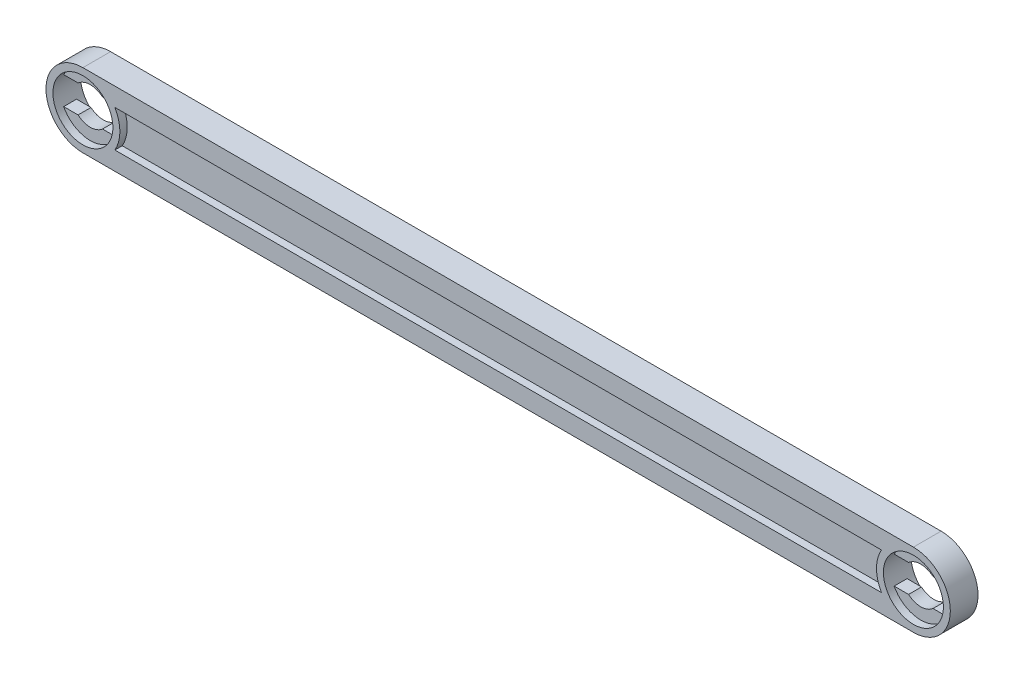
ISO-10303-21;
HEADER;
FILE_DESCRIPTION(('STEP AP214'),'2;1');
FILE_NAME('part.step','',(''),(''),'','','');
FILE_SCHEMA(('AUTOMOTIVE_DESIGN { 1 0 10303 214 1 1 1 1 }'));
ENDSEC;
DATA;
#1=APPLICATION_CONTEXT('core data for automotive mechanical design processes');
#2=APPLICATION_PROTOCOL_DEFINITION('international standard','automotive_design',2000,#1);
#3=PRODUCT_CONTEXT('',#1,'mechanical');
#4=PRODUCT('Part','Part','',(#3));
#5=PRODUCT_RELATED_PRODUCT_CATEGORY('part','',(#4));
#6=PRODUCT_DEFINITION_FORMATION('','',#4);
#7=PRODUCT_DEFINITION_CONTEXT('part definition',#1,'design');
#8=PRODUCT_DEFINITION('design','',#6,#7);
#9=PRODUCT_DEFINITION_SHAPE('','',#8);
#10=(LENGTH_UNIT() NAMED_UNIT(*) SI_UNIT(.MILLI.,.METRE.));
#11=(NAMED_UNIT(*) PLANE_ANGLE_UNIT() SI_UNIT($,.RADIAN.));
#12=(NAMED_UNIT(*) SI_UNIT($,.STERADIAN.) SOLID_ANGLE_UNIT());
#13=UNCERTAINTY_MEASURE_WITH_UNIT(LENGTH_MEASURE(1.E-05),#10,'distance_accuracy_value','');
#14=(GEOMETRIC_REPRESENTATION_CONTEXT(3) GLOBAL_UNCERTAINTY_ASSIGNED_CONTEXT((#13)) GLOBAL_UNIT_ASSIGNED_CONTEXT((#10,
#11,#12)) REPRESENTATION_CONTEXT('',''));
#15=CARTESIAN_POINT('',(0.,0.,0.));
#16=DIRECTION('',(0.,0.,1.));
#17=DIRECTION('',(1.,0.,0.));
#18=AXIS2_PLACEMENT_3D('',#15,#16,#17);
#19=CARTESIAN_POINT('',(90.,0.,0.));
#20=DIRECTION('',(0.,0.,1.));
#21=DIRECTION('',(1.,0.,0.));
#22=AXIS2_PLACEMENT_3D('',#19,#20,#21);
#23=PLANE('',#22);
#24=CARTESIAN_POINT('',(90.,0.,0.));
#25=DIRECTION('',(0.,0.,-1.));
#26=DIRECTION('',(1.,0.,0.));
#27=AXIS2_PLACEMENT_3D('',#24,#25,#26);
#28=CIRCLE('',#27,4.);
#29=CARTESIAN_POINT('',(86.5358983848622,-2.,0.));
#30=VERTEX_POINT('',#29);
#31=CARTESIAN_POINT('',(86.5358983848622,2.,0.));
#32=VERTEX_POINT('',#31);
#33=EDGE_CURVE('E57',#30,#32,#28,.T.);
#34=ORIENTED_EDGE('',*,*,#33,.F.);
#35=DIRECTION('',(1.,0.,0.));
#36=VECTOR('',#35,1.);
#37=CARTESIAN_POINT('',(3.46410161513775,-2.,0.));
#38=LINE('',#37,#36);
#39=CARTESIAN_POINT('',(3.46410161513775,-2.,0.));
#40=VERTEX_POINT('',#39);
#41=EDGE_CURVE('E261',#40,#30,#38,.T.);
#42=ORIENTED_EDGE('',*,*,#41,.F.);
#43=CARTESIAN_POINT('',(0.,0.,0.));
#44=DIRECTION('',(0.,0.,-1.));
#45=DIRECTION('',(1.,0.,0.));
#46=AXIS2_PLACEMENT_3D('',#43,#44,#45);
#47=CIRCLE('',#46,4.);
#48=CARTESIAN_POINT('',(3.46410161513776,2.,0.));
#49=VERTEX_POINT('',#48);
#50=EDGE_CURVE('E275',#49,#40,#47,.T.);
#51=ORIENTED_EDGE('',*,*,#50,.F.);
#52=DIRECTION('',(-1.,0.,0.));
#53=VECTOR('',#52,1.);
#54=CARTESIAN_POINT('',(3.46410161513775,2.,0.));
#55=LINE('',#54,#53);
#56=EDGE_CURVE('E272',#32,#49,#55,.T.);
#57=ORIENTED_EDGE('',*,*,#56,.F.);
#58=EDGE_LOOP('',(#34,#42,#51,#57));
#59=FACE_BOUND('',#58,.T.);
#60=CARTESIAN_POINT('',(90.,0.,0.));
#61=DIRECTION('',(0.,0.,1.));
#62=DIRECTION('',(1.,0.,0.));
#63=AXIS2_PLACEMENT_3D('',#60,#61,#62);
#64=CIRCLE('',#63,4.);
#65=CARTESIAN_POINT('',(90.,-4.,0.));
#66=VERTEX_POINT('',#65);
#67=CARTESIAN_POINT('',(90.,4.,0.));
#68=VERTEX_POINT('',#67);
#69=EDGE_CURVE('E393',#66,#68,#64,.T.);
#70=ORIENTED_EDGE('',*,*,#69,.T.);
#71=DIRECTION('',(-1.,0.,0.));
#72=VECTOR('',#71,1.);
#73=CARTESIAN_POINT('',(0.,4.,0.));
#74=LINE('',#73,#72);
#75=CARTESIAN_POINT('',(0.,4.,0.));
#76=VERTEX_POINT('',#75);
#77=EDGE_CURVE('E423',#68,#76,#74,.T.);
#78=ORIENTED_EDGE('',*,*,#77,.T.);
#79=CARTESIAN_POINT('',(0.,0.,0.));
#80=DIRECTION('',(0.,0.,1.));
#81=DIRECTION('',(1.,0.,0.));
#82=AXIS2_PLACEMENT_3D('',#79,#80,#81);
#83=CIRCLE('',#82,4.);
#84=CARTESIAN_POINT('',(0.,-4.,0.));
#85=VERTEX_POINT('',#84);
#86=EDGE_CURVE('E426',#76,#85,#83,.T.);
#87=ORIENTED_EDGE('',*,*,#86,.T.);
#88=DIRECTION('',(1.,0.,0.));
#89=VECTOR('',#88,1.);
#90=CARTESIAN_POINT('',(0.,-4.,0.));
#91=LINE('',#90,#89);
#92=EDGE_CURVE('E411',#85,#66,#91,.T.);
#93=ORIENTED_EDGE('',*,*,#92,.T.);
#94=EDGE_LOOP('',(#70,#78,#87,#93));
#95=FACE_BOUND('',#94,.T.);
#96=CARTESIAN_POINT('',(0.,0.,0.));
#97=DIRECTION('',(0.,0.,1.));
#98=DIRECTION('',(1.,0.,0.));
#99=AXIS2_PLACEMENT_3D('',#96,#97,#98);
#100=CIRCLE('',#99,3.25);
#101=CARTESIAN_POINT('',(3.25,0.,0.));
#102=VERTEX_POINT('',#101);
#103=EDGE_CURVE('E387',#102,#102,#100,.T.);
#104=ORIENTED_EDGE('',*,*,#103,.F.);
#105=EDGE_LOOP('',(#104));
#106=FACE_BOUND('',#105,.T.);
#107=CARTESIAN_POINT('',(90.,0.,0.));
#108=DIRECTION('',(0.,0.,-1.));
#109=DIRECTION('',(-1.,0.,0.));
#110=AXIS2_PLACEMENT_3D('',#107,#108,#109);
#111=CIRCLE('',#110,3.25);
#112=CARTESIAN_POINT('',(86.75,0.,0.));
#113=VERTEX_POINT('',#112);
#114=EDGE_CURVE('E324',#113,#113,#111,.T.);
#115=ORIENTED_EDGE('',*,*,#114,.T.);
#116=EDGE_LOOP('',(#115));
#117=FACE_BOUND('',#116,.T.);
#118=ADVANCED_FACE('F34',(#59,#95,#106,#117),#23,.T.);
#119=CARTESIAN_POINT('',(92.8831406486677,-1.5,-3.001));
#120=DIRECTION('',(0.,1.,0.));
#121=DIRECTION('',(0.,0.,1.));
#122=AXIS2_PLACEMENT_3D('',#119,#120,#121);
#123=PLANE('',#122);
#124=DIRECTION('',(1.,0.,0.));
#125=VECTOR('',#124,1.);
#126=CARTESIAN_POINT('',(92.8831406486677,-1.5,-2.2));
#127=LINE('',#126,#125);
#128=CARTESIAN_POINT('',(91.3228756555323,-1.5,-2.2));
#129=VERTEX_POINT('',#128);
#130=CARTESIAN_POINT('',(92.8831406486677,-1.5,-2.2));
#131=VERTEX_POINT('',#130);
#132=EDGE_CURVE('E300',#129,#131,#127,.T.);
#133=ORIENTED_EDGE('',*,*,#132,.F.);
#134=DIRECTION('',(0.,0.,1.));
#135=VECTOR('',#134,1.);
#136=CARTESIAN_POINT('',(91.3228756555323,-1.5,-3.001));
#137=LINE('',#136,#135);
#138=CARTESIAN_POINT('',(91.3228756555323,-1.5,-0.8));
#139=VERTEX_POINT('',#138);
#140=EDGE_CURVE('E331',#129,#139,#137,.T.);
#141=ORIENTED_EDGE('',*,*,#140,.T.);
#142=DIRECTION('',(1.,0.,0.));
#143=VECTOR('',#142,1.);
#144=CARTESIAN_POINT('',(92.8831406486677,-1.5,-0.8));
#145=LINE('',#144,#143);
#146=CARTESIAN_POINT('',(92.8831406486677,-1.5,-0.8));
#147=VERTEX_POINT('',#146);
#148=EDGE_CURVE('E318',#139,#147,#145,.T.);
#149=ORIENTED_EDGE('',*,*,#148,.T.);
#150=DIRECTION('',(0.,0.,1.));
#151=VECTOR('',#150,1.);
#152=CARTESIAN_POINT('',(92.8831406486677,-1.5,-3.001));
#153=LINE('',#152,#151);
#154=EDGE_CURVE('E328',#131,#147,#153,.T.);
#155=ORIENTED_EDGE('',*,*,#154,.F.);
#156=EDGE_LOOP('',(#133,#141,#149,#155));
#157=FACE_BOUND('',#156,.T.);
#158=ADVANCED_FACE('F476',(#157),#123,.T.);
#159=CARTESIAN_POINT('',(90.,0.,-3.001));
#160=DIRECTION('',(0.,0.,1.));
#161=DIRECTION('',(1.,0.,0.));
#162=AXIS2_PLACEMENT_3D('',#159,#160,#161);
#163=CYLINDRICAL_SURFACE('',#162,2.);
#164=CARTESIAN_POINT('',(90.,0.,-2.2));
#165=DIRECTION('',(0.,0.,1.));
#166=DIRECTION('',(1.,0.,0.));
#167=AXIS2_PLACEMENT_3D('',#164,#165,#166);
#168=CIRCLE('',#167,2.);
#169=CARTESIAN_POINT('',(88.6771243444677,-1.5,-2.2));
#170=VERTEX_POINT('',#169);
#171=EDGE_CURVE('E298',#170,#129,#168,.T.);
#172=ORIENTED_EDGE('',*,*,#171,.F.);
#173=DIRECTION('',(0.,0.,1.));
#174=VECTOR('',#173,1.);
#175=CARTESIAN_POINT('',(88.6771243444677,-1.5,-3.001));
#176=LINE('',#175,#174);
#177=CARTESIAN_POINT('',(88.6771243444677,-1.5,-0.800000000000001));
#178=VERTEX_POINT('',#177);
#179=EDGE_CURVE('E333',#170,#178,#176,.T.);
#180=ORIENTED_EDGE('',*,*,#179,.T.);
#181=CARTESIAN_POINT('',(90.,0.,-0.8));
#182=DIRECTION('',(0.,0.,1.));
#183=DIRECTION('',(1.,0.,0.));
#184=AXIS2_PLACEMENT_3D('',#181,#182,#183);
#185=CIRCLE('',#184,2.);
#186=EDGE_CURVE('E315',#178,#139,#185,.T.);
#187=ORIENTED_EDGE('',*,*,#186,.T.);
#188=ORIENTED_EDGE('',*,*,#140,.F.);
#189=EDGE_LOOP('',(#172,#180,#187,#188));
#190=FACE_BOUND('',#189,.T.);
#191=ADVANCED_FACE('F482',(#190),#163,.F.);
#192=CARTESIAN_POINT('',(88.6771243444677,-1.5,-3.001));
#193=DIRECTION('',(0.,1.,0.));
#194=DIRECTION('',(0.,0.,1.));
#195=AXIS2_PLACEMENT_3D('',#192,#193,#194);
#196=PLANE('',#195);
#197=DIRECTION('',(1.,0.,0.));
#198=VECTOR('',#197,1.);
#199=CARTESIAN_POINT('',(88.6771243444677,-1.5,-2.2));
#200=LINE('',#199,#198);
#201=CARTESIAN_POINT('',(87.1168593513323,-1.5,-2.2));
#202=VERTEX_POINT('',#201);
#203=EDGE_CURVE('E296',#202,#170,#200,.T.);
#204=ORIENTED_EDGE('',*,*,#203,.F.);
#205=DIRECTION('',(0.,0.,1.));
#206=VECTOR('',#205,1.);
#207=CARTESIAN_POINT('',(87.1168593513323,-1.5,-3.001));
#208=LINE('',#207,#206);
#209=CARTESIAN_POINT('',(87.1168593513323,-1.5,-0.8));
#210=VERTEX_POINT('',#209);
#211=EDGE_CURVE('E335',#202,#210,#208,.T.);
#212=ORIENTED_EDGE('',*,*,#211,.T.);
#213=DIRECTION('',(1.,0.,0.));
#214=VECTOR('',#213,1.);
#215=CARTESIAN_POINT('',(88.6771243444677,-1.5,-0.8));
#216=LINE('',#215,#214);
#217=EDGE_CURVE('E312',#210,#178,#216,.T.);
#218=ORIENTED_EDGE('',*,*,#217,.T.);
#219=ORIENTED_EDGE('',*,*,#179,.F.);
#220=EDGE_LOOP('',(#204,#212,#218,#219));
#221=FACE_BOUND('',#220,.T.);
#222=ADVANCED_FACE('F586',(#221),#196,.T.);
#223=CARTESIAN_POINT('',(88.6771243444677,1.5,-3.001));
#224=DIRECTION('',(0.,-1.,0.));
#225=DIRECTION('',(0.,0.,-1.));
#226=AXIS2_PLACEMENT_3D('',#223,#224,#225);
#227=PLANE('',#226);
#228=DIRECTION('',(-1.,0.,0.));
#229=VECTOR('',#228,1.);
#230=CARTESIAN_POINT('',(88.6771243444677,1.5,-2.2));
#231=LINE('',#230,#229);
#232=CARTESIAN_POINT('',(88.6771243444677,1.5,-2.2));
#233=VERTEX_POINT('',#232);
#234=CARTESIAN_POINT('',(87.1168593513323,1.5,-2.2));
#235=VERTEX_POINT('',#234);
#236=EDGE_CURVE('E294',#233,#235,#231,.T.);
#237=ORIENTED_EDGE('',*,*,#236,.F.);
#238=DIRECTION('',(0.,0.,1.));
#239=VECTOR('',#238,1.);
#240=CARTESIAN_POINT('',(88.6771243444677,1.5,-3.001));
#241=LINE('',#240,#239);
#242=CARTESIAN_POINT('',(88.6771243444677,1.5,-0.8));
#243=VERTEX_POINT('',#242);
#244=EDGE_CURVE('E339',#233,#243,#241,.T.);
#245=ORIENTED_EDGE('',*,*,#244,.T.);
#246=DIRECTION('',(-1.,0.,0.));
#247=VECTOR('',#246,1.);
#248=CARTESIAN_POINT('',(88.6771243444677,1.5,-0.8));
#249=LINE('',#248,#247);
#250=CARTESIAN_POINT('',(87.1168593513323,1.5,-0.8));
#251=VERTEX_POINT('',#250);
#252=EDGE_CURVE('E309',#243,#251,#249,.T.);
#253=ORIENTED_EDGE('',*,*,#252,.T.);
#254=DIRECTION('',(0.,0.,1.));
#255=VECTOR('',#254,1.);
#256=CARTESIAN_POINT('',(87.1168593513323,1.5,-3.001));
#257=LINE('',#256,#255);
#258=EDGE_CURVE('E337',#235,#251,#257,.T.);
#259=ORIENTED_EDGE('',*,*,#258,.F.);
#260=EDGE_LOOP('',(#237,#245,#253,#259));
#261=FACE_BOUND('',#260,.T.);
#262=ADVANCED_FACE('F590',(#261),#227,.T.);
#263=CARTESIAN_POINT('',(90.,0.,-3.001));
#264=DIRECTION('',(0.,0.,1.));
#265=DIRECTION('',(1.,0.,0.));
#266=AXIS2_PLACEMENT_3D('',#263,#264,#265);
#267=CYLINDRICAL_SURFACE('',#266,2.);
#268=CARTESIAN_POINT('',(90.,0.,-2.2));
#269=DIRECTION('',(0.,0.,1.));
#270=DIRECTION('',(1.,0.,0.));
#271=AXIS2_PLACEMENT_3D('',#268,#269,#270);
#272=CIRCLE('',#271,2.);
#273=CARTESIAN_POINT('',(91.3228756555323,1.5,-2.2));
#274=VERTEX_POINT('',#273);
#275=EDGE_CURVE('E292',#274,#233,#272,.T.);
#276=ORIENTED_EDGE('',*,*,#275,.F.);
#277=DIRECTION('',(0.,0.,1.));
#278=VECTOR('',#277,1.);
#279=CARTESIAN_POINT('',(91.3228756555323,1.5,-3.001));
#280=LINE('',#279,#278);
#281=CARTESIAN_POINT('',(91.3228756555323,1.5,-0.800000000000001));
#282=VERTEX_POINT('',#281);
#283=EDGE_CURVE('E341',#274,#282,#280,.T.);
#284=ORIENTED_EDGE('',*,*,#283,.T.);
#285=CARTESIAN_POINT('',(90.,0.,-0.8));
#286=DIRECTION('',(0.,0.,1.));
#287=DIRECTION('',(1.,0.,0.));
#288=AXIS2_PLACEMENT_3D('',#285,#286,#287);
#289=CIRCLE('',#288,2.);
#290=EDGE_CURVE('E306',#282,#243,#289,.T.);
#291=ORIENTED_EDGE('',*,*,#290,.T.);
#292=ORIENTED_EDGE('',*,*,#244,.F.);
#293=EDGE_LOOP('',(#276,#284,#291,#292));
#294=FACE_BOUND('',#293,.T.);
#295=ADVANCED_FACE('F532',(#294),#267,.F.);
#296=CARTESIAN_POINT('',(92.8831406486677,1.5,-3.001));
#297=DIRECTION('',(0.,-1.,0.));
#298=DIRECTION('',(0.,0.,-1.));
#299=AXIS2_PLACEMENT_3D('',#296,#297,#298);
#300=PLANE('',#299);
#301=DIRECTION('',(-1.,0.,0.));
#302=VECTOR('',#301,1.);
#303=CARTESIAN_POINT('',(92.8831406486677,1.5,-2.2));
#304=LINE('',#303,#302);
#305=CARTESIAN_POINT('',(92.8831406486677,1.5,-2.2));
#306=VERTEX_POINT('',#305);
#307=EDGE_CURVE('E290',#306,#274,#304,.T.);
#308=ORIENTED_EDGE('',*,*,#307,.F.);
#309=DIRECTION('',(0.,0.,1.));
#310=VECTOR('',#309,1.);
#311=CARTESIAN_POINT('',(92.8831406486677,1.5,-3.001));
#312=LINE('',#311,#310);
#313=CARTESIAN_POINT('',(92.8831406486677,1.5,-0.8));
#314=VERTEX_POINT('',#313);
#315=EDGE_CURVE('E327',#306,#314,#312,.T.);
#316=ORIENTED_EDGE('',*,*,#315,.T.);
#317=DIRECTION('',(-1.,0.,0.));
#318=VECTOR('',#317,1.);
#319=CARTESIAN_POINT('',(92.8831406486677,1.5,-0.8));
#320=LINE('',#319,#318);
#321=EDGE_CURVE('E11',#314,#282,#320,.T.);
#322=ORIENTED_EDGE('',*,*,#321,.T.);
#323=ORIENTED_EDGE('',*,*,#283,.F.);
#324=EDGE_LOOP('',(#308,#316,#322,#323));
#325=FACE_BOUND('',#324,.T.);
#326=ADVANCED_FACE('F518',(#325),#300,.T.);
#327=CARTESIAN_POINT('',(90.,0.,-3.));
#328=DIRECTION('',(0.,0.,1.));
#329=DIRECTION('',(1.,0.,0.));
#330=AXIS2_PLACEMENT_3D('',#327,#328,#329);
#331=PLANE('',#330);
#332=DIRECTION('',(-1.,0.,0.));
#333=VECTOR('',#332,1.);
#334=CARTESIAN_POINT('',(86.,-2.,-3.));
#335=LINE('',#334,#333);
#336=CARTESIAN_POINT('',(86.,-2.,-3.));
#337=VERTEX_POINT('',#336);
#338=CARTESIAN_POINT('',(4.,-2.,-3.));
#339=VERTEX_POINT('',#338);
#340=EDGE_CURVE('E248',#337,#339,#335,.T.);
#341=ORIENTED_EDGE('',*,*,#340,.F.);
#342=DIRECTION('',(0.,-1.,0.));
#343=VECTOR('',#342,1.);
#344=CARTESIAN_POINT('',(86.,-2.,-3.));
#345=LINE('',#344,#343);
#346=CARTESIAN_POINT('',(86.,2.,-3.));
#347=VERTEX_POINT('',#346);
#348=EDGE_CURVE('E49',#347,#337,#345,.T.);
#349=ORIENTED_EDGE('',*,*,#348,.F.);
#350=DIRECTION('',(1.,0.,0.));
#351=VECTOR('',#350,1.);
#352=CARTESIAN_POINT('',(86.,2.,-3.));
#353=LINE('',#352,#351);
#354=CARTESIAN_POINT('',(4.,2.,-3.));
#355=VERTEX_POINT('',#354);
#356=EDGE_CURVE('E239',#355,#347,#353,.T.);
#357=ORIENTED_EDGE('',*,*,#356,.F.);
#358=DIRECTION('',(0.,1.,0.));
#359=VECTOR('',#358,1.);
#360=CARTESIAN_POINT('',(4.,-2.,-3.));
#361=LINE('',#360,#359);
#362=EDGE_CURVE('E242',#339,#355,#361,.T.);
#363=ORIENTED_EDGE('',*,*,#362,.F.);
#364=EDGE_LOOP('',(#341,#349,#357,#363));
#365=FACE_BOUND('',#364,.T.);
#366=CARTESIAN_POINT('',(0.,0.,-3.));
#367=DIRECTION('',(0.,0.,1.));
#368=DIRECTION('',(1.,0.,0.));
#369=AXIS2_PLACEMENT_3D('',#366,#367,#368);
#370=CIRCLE('',#369,3.25);
#371=CARTESIAN_POINT('',(3.25,0.,-3.));
#372=VERTEX_POINT('',#371);
#373=EDGE_CURVE('E384',#372,#372,#370,.F.);
#374=ORIENTED_EDGE('',*,*,#373,.F.);
#375=EDGE_LOOP('',(#374));
#376=FACE_BOUND('',#375,.T.);
#377=CARTESIAN_POINT('',(90.,0.,-3.));
#378=DIRECTION('',(0.,0.,1.));
#379=DIRECTION('',(1.,0.,0.));
#380=AXIS2_PLACEMENT_3D('',#377,#378,#379);
#381=CIRCLE('',#380,4.);
#382=CARTESIAN_POINT('',(90.,-4.,-3.));
#383=VERTEX_POINT('',#382);
#384=CARTESIAN_POINT('',(90.,4.,-3.));
#385=VERTEX_POINT('',#384);
#386=EDGE_CURVE('E407',#383,#385,#381,.T.);
#387=ORIENTED_EDGE('',*,*,#386,.F.);
#388=DIRECTION('',(1.,0.,0.));
#389=VECTOR('',#388,1.);
#390=CARTESIAN_POINT('',(0.,-4.,-3.));
#391=LINE('',#390,#389);
#392=CARTESIAN_POINT('',(0.,-4.,-3.));
#393=VERTEX_POINT('',#392);
#394=EDGE_CURVE('E417',#393,#383,#391,.T.);
#395=ORIENTED_EDGE('',*,*,#394,.F.);
#396=CARTESIAN_POINT('',(0.,0.,-3.));
#397=DIRECTION('',(0.,0.,1.));
#398=DIRECTION('',(1.,0.,0.));
#399=AXIS2_PLACEMENT_3D('',#396,#397,#398);
#400=CIRCLE('',#399,4.);
#401=CARTESIAN_POINT('',(0.,4.,-3.));
#402=VERTEX_POINT('',#401);
#403=EDGE_CURVE('E414',#402,#393,#400,.T.);
#404=ORIENTED_EDGE('',*,*,#403,.F.);
#405=DIRECTION('',(-1.,0.,0.));
#406=VECTOR('',#405,1.);
#407=CARTESIAN_POINT('',(0.,4.,-3.));
#408=LINE('',#407,#406);
#409=EDGE_CURVE('E410',#385,#402,#408,.T.);
#410=ORIENTED_EDGE('',*,*,#409,.F.);
#411=EDGE_LOOP('',(#387,#395,#404,#410));
#412=FACE_BOUND('',#411,.T.);
#413=CARTESIAN_POINT('',(90.,0.,-3.));
#414=DIRECTION('',(0.,0.,1.));
#415=DIRECTION('',(1.,0.,0.));
#416=AXIS2_PLACEMENT_3D('',#413,#414,#415);
#417=CIRCLE('',#416,3.25);
#418=CARTESIAN_POINT('',(93.25,0.,-3.));
#419=VERTEX_POINT('',#418);
#420=EDGE_CURVE('E321',#419,#419,#417,.T.);
#421=ORIENTED_EDGE('',*,*,#420,.T.);
#422=EDGE_LOOP('',(#421));
#423=FACE_BOUND('',#422,.T.);
#424=ADVANCED_FACE('F488',(#365,#376,#412,#423),#331,.F.);
#425=CARTESIAN_POINT('',(-2.8831406486677,1.5,-3.001));
#426=DIRECTION('',(0.,1.,0.));
#427=DIRECTION('',(0.,0.,1.));
#428=AXIS2_PLACEMENT_3D('',#425,#426,#427);
#429=PLANE('',#428);
#430=DIRECTION('',(0.,0.,1.));
#431=VECTOR('',#430,1.);
#432=CARTESIAN_POINT('',(-2.8831406486677,1.5,-3.001));
#433=LINE('',#432,#431);
#434=CARTESIAN_POINT('',(-2.8831406486677,1.5,-2.2));
#435=VERTEX_POINT('',#434);
#436=CARTESIAN_POINT('',(-2.8831406486677,1.5,-0.8));
#437=VERTEX_POINT('',#436);
#438=EDGE_CURVE('E391',#435,#437,#433,.T.);
#439=ORIENTED_EDGE('',*,*,#438,.F.);
#440=DIRECTION('',(1.,0.,0.));
#441=VECTOR('',#440,1.);
#442=CARTESIAN_POINT('',(-2.8831406486677,1.5,-2.2));
#443=LINE('',#442,#441);
#444=CARTESIAN_POINT('',(-1.3228756555323,1.5,-2.2));
#445=VERTEX_POINT('',#444);
#446=EDGE_CURVE('E362',#435,#445,#443,.T.);
#447=ORIENTED_EDGE('',*,*,#446,.T.);
#448=DIRECTION('',(0.,0.,1.));
#449=VECTOR('',#448,1.);
#450=CARTESIAN_POINT('',(-1.3228756555323,1.5,-3.001));
#451=LINE('',#450,#449);
#452=CARTESIAN_POINT('',(-1.3228756555323,1.5,-0.8));
#453=VERTEX_POINT('',#452);
#454=EDGE_CURVE('E394',#445,#453,#451,.T.);
#455=ORIENTED_EDGE('',*,*,#454,.T.);
#456=DIRECTION('',(1.,0.,0.));
#457=VECTOR('',#456,1.);
#458=CARTESIAN_POINT('',(-2.8831406486677,1.5,-0.8));
#459=LINE('',#458,#457);
#460=EDGE_CURVE('E381',#437,#453,#459,.T.);
#461=ORIENTED_EDGE('',*,*,#460,.F.);
#462=EDGE_LOOP('',(#439,#447,#455,#461));
#463=FACE_BOUND('',#462,.T.);
#464=ADVANCED_FACE('F517',(#463),#429,.F.);
#465=CARTESIAN_POINT('',(0.,0.,-3.001));
#466=DIRECTION('',(0.,0.,1.));
#467=DIRECTION('',(1.,0.,0.));
#468=AXIS2_PLACEMENT_3D('',#465,#466,#467);
#469=CYLINDRICAL_SURFACE('',#468,2.);
#470=ORIENTED_EDGE('',*,*,#454,.F.);
#471=CARTESIAN_POINT('',(0.,0.,-2.2));
#472=DIRECTION('',(0.,0.,1.));
#473=DIRECTION('',(1.,0.,0.));
#474=AXIS2_PLACEMENT_3D('',#471,#472,#473);
#475=CIRCLE('',#474,2.);
#476=CARTESIAN_POINT('',(1.3228756555323,1.5,-2.2));
#477=VERTEX_POINT('',#476);
#478=EDGE_CURVE('E359',#445,#477,#475,.F.);
#479=ORIENTED_EDGE('',*,*,#478,.T.);
#480=DIRECTION('',(0.,0.,1.));
#481=VECTOR('',#480,1.);
#482=CARTESIAN_POINT('',(1.3228756555323,1.5,-3.001));
#483=LINE('',#482,#481);
#484=CARTESIAN_POINT('',(1.3228756555323,1.5,-0.800000000000001));
#485=VERTEX_POINT('',#484);
#486=EDGE_CURVE('E396',#477,#485,#483,.T.);
#487=ORIENTED_EDGE('',*,*,#486,.T.);
#488=CARTESIAN_POINT('',(0.,0.,-0.8));
#489=DIRECTION('',(0.,0.,1.));
#490=DIRECTION('',(1.,0.,0.));
#491=AXIS2_PLACEMENT_3D('',#488,#489,#490);
#492=CIRCLE('',#491,2.);
#493=EDGE_CURVE('E378',#453,#485,#492,.F.);
#494=ORIENTED_EDGE('',*,*,#493,.F.);
#495=EDGE_LOOP('',(#470,#479,#487,#494));
#496=FACE_BOUND('',#495,.T.);
#497=ADVANCED_FACE('F529',(#496),#469,.F.);
#498=CARTESIAN_POINT('',(1.3228756555323,1.5,-3.001));
#499=DIRECTION('',(0.,1.,0.));
#500=DIRECTION('',(0.,0.,1.));
#501=AXIS2_PLACEMENT_3D('',#498,#499,#500);
#502=PLANE('',#501);
#503=ORIENTED_EDGE('',*,*,#486,.F.);
#504=DIRECTION('',(1.,0.,0.));
#505=VECTOR('',#504,1.);
#506=CARTESIAN_POINT('',(1.3228756555323,1.5,-2.2));
#507=LINE('',#506,#505);
#508=CARTESIAN_POINT('',(2.8831406486677,1.5,-2.2));
#509=VERTEX_POINT('',#508);
#510=EDGE_CURVE('E356',#477,#509,#507,.T.);
#511=ORIENTED_EDGE('',*,*,#510,.T.);
#512=DIRECTION('',(0.,0.,1.));
#513=VECTOR('',#512,1.);
#514=CARTESIAN_POINT('',(2.8831406486677,1.5,-3.001));
#515=LINE('',#514,#513);
#516=CARTESIAN_POINT('',(2.8831406486677,1.5,-0.8));
#517=VERTEX_POINT('',#516);
#518=EDGE_CURVE('E398',#509,#517,#515,.T.);
#519=ORIENTED_EDGE('',*,*,#518,.T.);
#520=DIRECTION('',(1.,0.,0.));
#521=VECTOR('',#520,1.);
#522=CARTESIAN_POINT('',(1.3228756555323,1.5,-0.8));
#523=LINE('',#522,#521);
#524=EDGE_CURVE('E375',#485,#517,#523,.T.);
#525=ORIENTED_EDGE('',*,*,#524,.F.);
#526=EDGE_LOOP('',(#503,#511,#519,#525));
#527=FACE_BOUND('',#526,.T.);
#528=ADVANCED_FACE('F807',(#527),#502,.F.);
#529=CARTESIAN_POINT('',(1.3228756555323,-1.5,-3.001));
#530=DIRECTION('',(0.,-1.,0.));
#531=DIRECTION('',(0.,0.,-1.));
#532=AXIS2_PLACEMENT_3D('',#529,#530,#531);
#533=PLANE('',#532);
#534=DIRECTION('',(0.,0.,1.));
#535=VECTOR('',#534,1.);
#536=CARTESIAN_POINT('',(2.8831406486677,-1.5,-3.001));
#537=LINE('',#536,#535);
#538=CARTESIAN_POINT('',(2.8831406486677,-1.5,-2.2));
#539=VERTEX_POINT('',#538);
#540=CARTESIAN_POINT('',(2.8831406486677,-1.5,-0.8));
#541=VERTEX_POINT('',#540);
#542=EDGE_CURVE('E400',#539,#541,#537,.T.);
#543=ORIENTED_EDGE('',*,*,#542,.F.);
#544=DIRECTION('',(-1.,0.,0.));
#545=VECTOR('',#544,1.);
#546=CARTESIAN_POINT('',(1.3228756555323,-1.5,-2.2));
#547=LINE('',#546,#545);
#548=CARTESIAN_POINT('',(1.32287565553229,-1.5,-2.2));
#549=VERTEX_POINT('',#548);
#550=EDGE_CURVE('E353',#539,#549,#547,.T.);
#551=ORIENTED_EDGE('',*,*,#550,.T.);
#552=DIRECTION('',(0.,0.,1.));
#553=VECTOR('',#552,1.);
#554=CARTESIAN_POINT('',(1.32287565553229,-1.5,-3.001));
#555=LINE('',#554,#553);
#556=CARTESIAN_POINT('',(1.32287565553229,-1.5,-0.8));
#557=VERTEX_POINT('',#556);
#558=EDGE_CURVE('E402',#549,#557,#555,.T.);
#559=ORIENTED_EDGE('',*,*,#558,.T.);
#560=DIRECTION('',(-1.,0.,0.));
#561=VECTOR('',#560,1.);
#562=CARTESIAN_POINT('',(1.3228756555323,-1.5,-0.8));
#563=LINE('',#562,#561);
#564=EDGE_CURVE('E372',#541,#557,#563,.T.);
#565=ORIENTED_EDGE('',*,*,#564,.F.);
#566=EDGE_LOOP('',(#543,#551,#559,#565));
#567=FACE_BOUND('',#566,.T.);
#568=ADVANCED_FACE('F454',(#567),#533,.F.);
#569=CARTESIAN_POINT('',(0.,0.,-3.001));
#570=DIRECTION('',(0.,0.,1.));
#571=DIRECTION('',(1.,0.,0.));
#572=AXIS2_PLACEMENT_3D('',#569,#570,#571);
#573=CYLINDRICAL_SURFACE('',#572,2.);
#574=ORIENTED_EDGE('',*,*,#558,.F.);
#575=CARTESIAN_POINT('',(0.,0.,-2.2));
#576=DIRECTION('',(0.,0.,1.));
#577=DIRECTION('',(1.,0.,0.));
#578=AXIS2_PLACEMENT_3D('',#575,#576,#577);
#579=CIRCLE('',#578,2.);
#580=CARTESIAN_POINT('',(-1.3228756555323,-1.5,-2.2));
#581=VERTEX_POINT('',#580);
#582=EDGE_CURVE('E350',#549,#581,#579,.F.);
#583=ORIENTED_EDGE('',*,*,#582,.T.);
#584=DIRECTION('',(0.,0.,1.));
#585=VECTOR('',#584,1.);
#586=CARTESIAN_POINT('',(-1.3228756555323,-1.5,-3.001));
#587=LINE('',#586,#585);
#588=CARTESIAN_POINT('',(-1.3228756555323,-1.5,-0.800000000000001));
#589=VERTEX_POINT('',#588);
#590=EDGE_CURVE('E404',#581,#589,#587,.T.);
#591=ORIENTED_EDGE('',*,*,#590,.T.);
#592=CARTESIAN_POINT('',(0.,0.,-0.8));
#593=DIRECTION('',(0.,0.,1.));
#594=DIRECTION('',(1.,0.,0.));
#595=AXIS2_PLACEMENT_3D('',#592,#593,#594);
#596=CIRCLE('',#595,2.);
#597=EDGE_CURVE('E369',#557,#589,#596,.F.);
#598=ORIENTED_EDGE('',*,*,#597,.F.);
#599=EDGE_LOOP('',(#574,#583,#591,#598));
#600=FACE_BOUND('',#599,.T.);
#601=ADVANCED_FACE('F457',(#600),#573,.F.);
#602=CARTESIAN_POINT('',(-2.8831406486677,-1.5,-3.001));
#603=DIRECTION('',(0.,-1.,0.));
#604=DIRECTION('',(0.,0.,-1.));
#605=AXIS2_PLACEMENT_3D('',#602,#603,#604);
#606=PLANE('',#605);
#607=ORIENTED_EDGE('',*,*,#590,.F.);
#608=DIRECTION('',(-1.,0.,0.));
#609=VECTOR('',#608,1.);
#610=CARTESIAN_POINT('',(-2.8831406486677,-1.5,-2.2));
#611=LINE('',#610,#609);
#612=CARTESIAN_POINT('',(-2.8831406486677,-1.5,-2.2));
#613=VERTEX_POINT('',#612);
#614=EDGE_CURVE('E347',#581,#613,#611,.T.);
#615=ORIENTED_EDGE('',*,*,#614,.T.);
#616=DIRECTION('',(0.,0.,1.));
#617=VECTOR('',#616,1.);
#618=CARTESIAN_POINT('',(-2.8831406486677,-1.5,-3.001));
#619=LINE('',#618,#617);
#620=CARTESIAN_POINT('',(-2.8831406486677,-1.5,-0.8));
#621=VERTEX_POINT('',#620);
#622=EDGE_CURVE('E390',#613,#621,#619,.T.);
#623=ORIENTED_EDGE('',*,*,#622,.T.);
#624=DIRECTION('',(-1.,0.,0.));
#625=VECTOR('',#624,1.);
#626=CARTESIAN_POINT('',(-2.8831406486677,-1.5,-0.8));
#627=LINE('',#626,#625);
#628=EDGE_CURVE('E42',#589,#621,#627,.T.);
#629=ORIENTED_EDGE('',*,*,#628,.F.);
#630=EDGE_LOOP('',(#607,#615,#623,#629));
#631=FACE_BOUND('',#630,.T.);
#632=ADVANCED_FACE('F458',(#631),#606,.F.);
#633=CARTESIAN_POINT('',(90.,0.,-3.));
#634=DIRECTION('',(0.,0.,1.));
#635=DIRECTION('',(1.,0.,0.));
#636=AXIS2_PLACEMENT_3D('',#633,#634,#635);
#637=CYLINDRICAL_SURFACE('',#636,4.);
#638=ORIENTED_EDGE('',*,*,#69,.F.);
#639=DIRECTION('',(0.,0.,1.));
#640=VECTOR('',#639,1.);
#641=CARTESIAN_POINT('',(90.,-4.,-3.));
#642=LINE('',#641,#640);
#643=EDGE_CURVE('E431',#383,#66,#642,.T.);
#644=ORIENTED_EDGE('',*,*,#643,.F.);
#645=ORIENTED_EDGE('',*,*,#386,.T.);
#646=DIRECTION('',(0.,0.,1.));
#647=VECTOR('',#646,1.);
#648=CARTESIAN_POINT('',(90.,4.,-3.));
#649=LINE('',#648,#647);
#650=EDGE_CURVE('E420',#385,#68,#649,.T.);
#651=ORIENTED_EDGE('',*,*,#650,.T.);
#652=EDGE_LOOP('',(#638,#644,#645,#651));
#653=FACE_BOUND('',#652,.T.);
#654=ADVANCED_FACE('F36',(#653),#637,.T.);
#655=CARTESIAN_POINT('',(0.,-4.,-3.));
#656=DIRECTION('',(0.,-1.,0.));
#657=DIRECTION('',(0.,0.,-1.));
#658=AXIS2_PLACEMENT_3D('',#655,#656,#657);
#659=PLANE('',#658);
#660=ORIENTED_EDGE('',*,*,#92,.F.);
#661=DIRECTION('',(0.,0.,1.));
#662=VECTOR('',#661,1.);
#663=CARTESIAN_POINT('',(0.,-4.,-3.));
#664=LINE('',#663,#662);
#665=EDGE_CURVE('E433',#393,#85,#664,.T.);
#666=ORIENTED_EDGE('',*,*,#665,.F.);
#667=ORIENTED_EDGE('',*,*,#394,.T.);
#668=ORIENTED_EDGE('',*,*,#643,.T.);
#669=EDGE_LOOP('',(#660,#666,#667,#668));
#670=FACE_BOUND('',#669,.T.);
#671=ADVANCED_FACE('F490',(#670),#659,.T.);
#672=CARTESIAN_POINT('',(0.,0.,-3.));
#673=DIRECTION('',(0.,0.,1.));
#674=DIRECTION('',(1.,0.,0.));
#675=AXIS2_PLACEMENT_3D('',#672,#673,#674);
#676=CYLINDRICAL_SURFACE('',#675,4.);
#677=ORIENTED_EDGE('',*,*,#86,.F.);
#678=DIRECTION('',(0.,0.,1.));
#679=VECTOR('',#678,1.);
#680=CARTESIAN_POINT('',(0.,4.,-3.));
#681=LINE('',#680,#679);
#682=EDGE_CURVE('E435',#402,#76,#681,.T.);
#683=ORIENTED_EDGE('',*,*,#682,.F.);
#684=ORIENTED_EDGE('',*,*,#403,.T.);
#685=ORIENTED_EDGE('',*,*,#665,.T.);
#686=EDGE_LOOP('',(#677,#683,#684,#685));
#687=FACE_BOUND('',#686,.T.);
#688=ADVANCED_FACE('F493',(#687),#676,.T.);
#689=CARTESIAN_POINT('',(0.,4.,-3.));
#690=DIRECTION('',(0.,1.,0.));
#691=DIRECTION('',(0.,0.,1.));
#692=AXIS2_PLACEMENT_3D('',#689,#690,#691);
#693=PLANE('',#692);
#694=ORIENTED_EDGE('',*,*,#77,.F.);
#695=ORIENTED_EDGE('',*,*,#650,.F.);
#696=ORIENTED_EDGE('',*,*,#409,.T.);
#697=ORIENTED_EDGE('',*,*,#682,.T.);
#698=EDGE_LOOP('',(#694,#695,#696,#697));
#699=FACE_BOUND('',#698,.T.);
#700=ADVANCED_FACE('F496',(#699),#693,.T.);
#701=CARTESIAN_POINT('',(0.,0.,-3.001));
#702=DIRECTION('',(0.,0.,1.));
#703=DIRECTION('',(1.,0.,0.));
#704=AXIS2_PLACEMENT_3D('',#701,#702,#703);
#705=CYLINDRICAL_SURFACE('',#704,3.25);
#706=CARTESIAN_POINT('',(0.,0.,-2.2));
#707=DIRECTION('',(0.,0.,1.));
#708=DIRECTION('',(1.,0.,0.));
#709=AXIS2_PLACEMENT_3D('',#706,#707,#708);
#710=CIRCLE('',#709,3.25);
#711=EDGE_CURVE('E344',#509,#435,#710,.T.);
#712=ORIENTED_EDGE('',*,*,#711,.T.);
#713=ORIENTED_EDGE('',*,*,#438,.T.);
#714=CARTESIAN_POINT('',(0.,0.,-0.8));
#715=DIRECTION('',(0.,0.,1.));
#716=DIRECTION('',(1.,0.,0.));
#717=AXIS2_PLACEMENT_3D('',#714,#715,#716);
#718=CIRCLE('',#717,3.25);
#719=EDGE_CURVE('E366',#517,#437,#718,.T.);
#720=ORIENTED_EDGE('',*,*,#719,.F.);
#721=ORIENTED_EDGE('',*,*,#518,.F.);
#722=EDGE_LOOP('',(#712,#713,#720,#721));
#723=FACE_BOUND('',#722,.T.);
#724=EDGE_CURVE('E330',#613,#539,#710,.T.);
#725=ORIENTED_EDGE('',*,*,#724,.T.);
#726=ORIENTED_EDGE('',*,*,#542,.T.);
#727=EDGE_CURVE('E365',#621,#541,#718,.T.);
#728=ORIENTED_EDGE('',*,*,#727,.F.);
#729=ORIENTED_EDGE('',*,*,#622,.F.);
#730=EDGE_LOOP('',(#725,#726,#728,#729));
#731=FACE_BOUND('',#730,.T.);
#732=ORIENTED_EDGE('',*,*,#103,.T.);
#733=EDGE_LOOP('',(#732));
#734=FACE_BOUND('',#733,.T.);
#735=ORIENTED_EDGE('',*,*,#373,.T.);
#736=EDGE_LOOP('',(#735));
#737=FACE_BOUND('',#736,.T.);
#738=ADVANCED_FACE('F450',(#723,#731,#734,#737),#705,.F.);
#739=CARTESIAN_POINT('',(0.,0.,-0.8));
#740=DIRECTION('',(0.,0.,1.));
#741=DIRECTION('',(1.,0.,0.));
#742=AXIS2_PLACEMENT_3D('',#739,#740,#741);
#743=PLANE('',#742);
#744=ORIENTED_EDGE('',*,*,#564,.T.);
#745=ORIENTED_EDGE('',*,*,#597,.T.);
#746=ORIENTED_EDGE('',*,*,#628,.T.);
#747=ORIENTED_EDGE('',*,*,#727,.T.);
#748=EDGE_LOOP('',(#744,#745,#746,#747));
#749=FACE_BOUND('',#748,.T.);
#750=ADVANCED_FACE('F442',(#749),#743,.T.);
#751=ORIENTED_EDGE('',*,*,#460,.T.);
#752=ORIENTED_EDGE('',*,*,#493,.T.);
#753=ORIENTED_EDGE('',*,*,#524,.T.);
#754=ORIENTED_EDGE('',*,*,#719,.T.);
#755=EDGE_LOOP('',(#751,#752,#753,#754));
#756=FACE_BOUND('',#755,.T.);
#757=ADVANCED_FACE('F472',(#756),#743,.T.);
#758=CARTESIAN_POINT('',(0.,0.,-2.2));
#759=DIRECTION('',(0.,0.,1.));
#760=DIRECTION('',(1.,0.,0.));
#761=AXIS2_PLACEMENT_3D('',#758,#759,#760);
#762=PLANE('',#761);
#763=ORIENTED_EDGE('',*,*,#711,.F.);
#764=ORIENTED_EDGE('',*,*,#510,.F.);
#765=ORIENTED_EDGE('',*,*,#478,.F.);
#766=ORIENTED_EDGE('',*,*,#446,.F.);
#767=EDGE_LOOP('',(#763,#764,#765,#766));
#768=FACE_BOUND('',#767,.T.);
#769=ADVANCED_FACE('F463',(#768),#762,.F.);
#770=ORIENTED_EDGE('',*,*,#724,.F.);
#771=ORIENTED_EDGE('',*,*,#614,.F.);
#772=ORIENTED_EDGE('',*,*,#582,.F.);
#773=ORIENTED_EDGE('',*,*,#550,.F.);
#774=EDGE_LOOP('',(#770,#771,#772,#773));
#775=FACE_BOUND('',#774,.T.);
#776=ADVANCED_FACE('F460',(#775),#762,.F.);
#777=CARTESIAN_POINT('',(90.,0.,-3.001));
#778=DIRECTION('',(0.,0.,1.));
#779=DIRECTION('',(1.,0.,0.));
#780=AXIS2_PLACEMENT_3D('',#777,#778,#779);
#781=CYLINDRICAL_SURFACE('',#780,3.25);
#782=CARTESIAN_POINT('',(90.,0.,-2.2));
#783=DIRECTION('',(0.,0.,-1.));
#784=DIRECTION('',(-1.,0.,0.));
#785=AXIS2_PLACEMENT_3D('',#782,#783,#784);
#786=CIRCLE('',#785,3.25);
#787=EDGE_CURVE('E282',#131,#202,#786,.T.);
#788=ORIENTED_EDGE('',*,*,#787,.F.);
#789=ORIENTED_EDGE('',*,*,#154,.T.);
#790=CARTESIAN_POINT('',(90.,0.,-0.8));
#791=DIRECTION('',(0.,0.,-1.));
#792=DIRECTION('',(-1.,0.,0.));
#793=AXIS2_PLACEMENT_3D('',#790,#791,#792);
#794=CIRCLE('',#793,3.25);
#795=EDGE_CURVE('E302',#147,#210,#794,.T.);
#796=ORIENTED_EDGE('',*,*,#795,.T.);
#797=ORIENTED_EDGE('',*,*,#211,.F.);
#798=EDGE_LOOP('',(#788,#789,#796,#797));
#799=FACE_BOUND('',#798,.T.);
#800=EDGE_CURVE('E288',#235,#306,#786,.T.);
#801=ORIENTED_EDGE('',*,*,#800,.F.);
#802=ORIENTED_EDGE('',*,*,#258,.T.);
#803=EDGE_CURVE('E303',#251,#314,#794,.T.);
#804=ORIENTED_EDGE('',*,*,#803,.T.);
#805=ORIENTED_EDGE('',*,*,#315,.F.);
#806=EDGE_LOOP('',(#801,#802,#804,#805));
#807=FACE_BOUND('',#806,.T.);
#808=ORIENTED_EDGE('',*,*,#420,.F.);
#809=EDGE_LOOP('',(#808));
#810=FACE_BOUND('',#809,.T.);
#811=ORIENTED_EDGE('',*,*,#114,.F.);
#812=EDGE_LOOP('',(#811));
#813=FACE_BOUND('',#812,.T.);
#814=ADVANCED_FACE('F462',(#799,#807,#810,#813),#781,.F.);
#815=CARTESIAN_POINT('',(90.,0.,-0.8));
#816=DIRECTION('',(0.,0.,1.));
#817=DIRECTION('',(-1.,0.,0.));
#818=AXIS2_PLACEMENT_3D('',#815,#816,#817);
#819=PLANE('',#818);
#820=ORIENTED_EDGE('',*,*,#290,.F.);
#821=ORIENTED_EDGE('',*,*,#321,.F.);
#822=ORIENTED_EDGE('',*,*,#803,.F.);
#823=ORIENTED_EDGE('',*,*,#252,.F.);
#824=EDGE_LOOP('',(#820,#821,#822,#823));
#825=FACE_BOUND('',#824,.T.);
#826=ADVANCED_FACE('F469',(#825),#819,.T.);
#827=ORIENTED_EDGE('',*,*,#186,.F.);
#828=ORIENTED_EDGE('',*,*,#217,.F.);
#829=ORIENTED_EDGE('',*,*,#795,.F.);
#830=ORIENTED_EDGE('',*,*,#148,.F.);
#831=EDGE_LOOP('',(#827,#828,#829,#830));
#832=FACE_BOUND('',#831,.T.);
#833=ADVANCED_FACE('F581',(#832),#819,.T.);
#834=CARTESIAN_POINT('',(90.,0.,-2.2));
#835=DIRECTION('',(0.,0.,1.));
#836=DIRECTION('',(-1.,0.,0.));
#837=AXIS2_PLACEMENT_3D('',#834,#835,#836);
#838=PLANE('',#837);
#839=ORIENTED_EDGE('',*,*,#132,.T.);
#840=ORIENTED_EDGE('',*,*,#787,.T.);
#841=ORIENTED_EDGE('',*,*,#203,.T.);
#842=ORIENTED_EDGE('',*,*,#171,.T.);
#843=EDGE_LOOP('',(#839,#840,#841,#842));
#844=FACE_BOUND('',#843,.T.);
#845=ADVANCED_FACE('F578',(#844),#838,.F.);
#846=ORIENTED_EDGE('',*,*,#236,.T.);
#847=ORIENTED_EDGE('',*,*,#800,.T.);
#848=ORIENTED_EDGE('',*,*,#307,.T.);
#849=ORIENTED_EDGE('',*,*,#275,.T.);
#850=EDGE_LOOP('',(#846,#847,#848,#849));
#851=FACE_BOUND('',#850,.T.);
#852=ADVANCED_FACE('F575',(#851),#838,.F.);
#853=CARTESIAN_POINT('',(90.,0.,-0.8));
#854=DIRECTION('',(0.,0.,1.));
#855=DIRECTION('',(1.,0.,0.));
#856=AXIS2_PLACEMENT_3D('',#853,#854,#855);
#857=CYLINDRICAL_SURFACE('',#856,4.);
#858=ORIENTED_EDGE('',*,*,#33,.T.);
#859=DIRECTION('',(0.,0.,1.));
#860=VECTOR('',#859,1.);
#861=CARTESIAN_POINT('',(86.5358983848622,2.,-0.8));
#862=LINE('',#861,#860);
#863=CARTESIAN_POINT('',(86.5358983848622,2.,-0.8));
#864=VERTEX_POINT('',#863);
#865=EDGE_CURVE('E270',#864,#32,#862,.T.);
#866=ORIENTED_EDGE('',*,*,#865,.F.);
#867=CARTESIAN_POINT('',(90.,0.,-0.8));
#868=DIRECTION('',(0.,0.,-1.));
#869=DIRECTION('',(1.,0.,0.));
#870=AXIS2_PLACEMENT_3D('',#867,#868,#869);
#871=CIRCLE('',#870,4.);
#872=CARTESIAN_POINT('',(86.5358983848622,-2.,-0.8));
#873=VERTEX_POINT('',#872);
#874=EDGE_CURVE('E257',#873,#864,#871,.T.);
#875=ORIENTED_EDGE('',*,*,#874,.F.);
#876=DIRECTION('',(0.,0.,1.));
#877=VECTOR('',#876,1.);
#878=CARTESIAN_POINT('',(86.5358983848622,-2.,-0.8));
#879=LINE('',#878,#877);
#880=EDGE_CURVE('E280',#873,#30,#879,.T.);
#881=ORIENTED_EDGE('',*,*,#880,.T.);
#882=EDGE_LOOP('',(#858,#866,#875,#881));
#883=FACE_BOUND('',#882,.T.);
#884=ADVANCED_FACE('F565',(#883),#857,.T.);
#885=CARTESIAN_POINT('',(3.46410161513775,-2.,-0.8));
#886=DIRECTION('',(0.,-1.,0.));
#887=DIRECTION('',(1.,0.,0.));
#888=AXIS2_PLACEMENT_3D('',#885,#886,#887);
#889=PLANE('',#888);
#890=ORIENTED_EDGE('',*,*,#41,.T.);
#891=ORIENTED_EDGE('',*,*,#880,.F.);
#892=DIRECTION('',(1.,0.,0.));
#893=VECTOR('',#892,1.);
#894=CARTESIAN_POINT('',(3.46410161513775,-2.,-0.8));
#895=LINE('',#894,#893);
#896=CARTESIAN_POINT('',(3.46410161513775,-2.,-0.8));
#897=VERTEX_POINT('',#896);
#898=EDGE_CURVE('E267',#897,#873,#895,.T.);
#899=ORIENTED_EDGE('',*,*,#898,.F.);
#900=DIRECTION('',(0.,0.,1.));
#901=VECTOR('',#900,1.);
#902=CARTESIAN_POINT('',(3.46410161513775,-2.,-0.8));
#903=LINE('',#902,#901);
#904=EDGE_CURVE('E283',#897,#40,#903,.T.);
#905=ORIENTED_EDGE('',*,*,#904,.T.);
#906=EDGE_LOOP('',(#890,#891,#899,#905));
#907=FACE_BOUND('',#906,.T.);
#908=ADVANCED_FACE('F561',(#907),#889,.F.);
#909=CARTESIAN_POINT('',(0.,0.,-0.8));
#910=DIRECTION('',(0.,0.,1.));
#911=DIRECTION('',(1.,0.,0.));
#912=AXIS2_PLACEMENT_3D('',#909,#910,#911);
#913=CYLINDRICAL_SURFACE('',#912,4.);
#914=ORIENTED_EDGE('',*,*,#50,.T.);
#915=ORIENTED_EDGE('',*,*,#904,.F.);
#916=CARTESIAN_POINT('',(0.,0.,-0.8));
#917=DIRECTION('',(0.,0.,-1.));
#918=DIRECTION('',(1.,0.,0.));
#919=AXIS2_PLACEMENT_3D('',#916,#917,#918);
#920=CIRCLE('',#919,4.);
#921=CARTESIAN_POINT('',(3.46410161513776,2.,-0.8));
#922=VERTEX_POINT('',#921);
#923=EDGE_CURVE('E264',#922,#897,#920,.T.);
#924=ORIENTED_EDGE('',*,*,#923,.F.);
#925=DIRECTION('',(0.,0.,1.));
#926=VECTOR('',#925,1.);
#927=CARTESIAN_POINT('',(3.46410161513776,2.,-0.8));
#928=LINE('',#927,#926);
#929=EDGE_CURVE('E285',#922,#49,#928,.T.);
#930=ORIENTED_EDGE('',*,*,#929,.T.);
#931=EDGE_LOOP('',(#914,#915,#924,#930));
#932=FACE_BOUND('',#931,.T.);
#933=ADVANCED_FACE('F564',(#932),#913,.T.);
#934=CARTESIAN_POINT('',(3.46410161513775,2.,-0.8));
#935=DIRECTION('',(0.,1.,0.));
#936=DIRECTION('',(0.,0.,1.));
#937=AXIS2_PLACEMENT_3D('',#934,#935,#936);
#938=PLANE('',#937);
#939=ORIENTED_EDGE('',*,*,#56,.T.);
#940=ORIENTED_EDGE('',*,*,#929,.F.);
#941=DIRECTION('',(-1.,0.,0.));
#942=VECTOR('',#941,1.);
#943=CARTESIAN_POINT('',(3.46410161513775,2.,-0.8));
#944=LINE('',#943,#942);
#945=EDGE_CURVE('E260',#864,#922,#944,.T.);
#946=ORIENTED_EDGE('',*,*,#945,.F.);
#947=ORIENTED_EDGE('',*,*,#865,.T.);
#948=EDGE_LOOP('',(#939,#940,#946,#947));
#949=FACE_BOUND('',#948,.T.);
#950=ADVANCED_FACE('F559',(#949),#938,.F.);
#951=CARTESIAN_POINT('',(90.,0.,-0.8));
#952=DIRECTION('',(0.,0.,1.));
#953=DIRECTION('',(1.,0.,0.));
#954=AXIS2_PLACEMENT_3D('',#951,#952,#953);
#955=PLANE('',#954);
#956=ORIENTED_EDGE('',*,*,#874,.T.);
#957=ORIENTED_EDGE('',*,*,#945,.T.);
#958=ORIENTED_EDGE('',*,*,#923,.T.);
#959=ORIENTED_EDGE('',*,*,#898,.T.);
#960=EDGE_LOOP('',(#956,#957,#958,#959));
#961=FACE_BOUND('',#960,.T.);
#962=ADVANCED_FACE('F551',(#961),#955,.T.);
#963=CARTESIAN_POINT('',(86.,-2.,-2.2));
#964=DIRECTION('',(1.,0.,0.));
#965=DIRECTION('',(0.,0.,-1.));
#966=AXIS2_PLACEMENT_3D('',#963,#964,#965);
#967=PLANE('',#966);
#968=ORIENTED_EDGE('',*,*,#348,.T.);
#969=DIRECTION('',(0.,0.,-1.));
#970=VECTOR('',#969,1.);
#971=CARTESIAN_POINT('',(86.,-2.,-2.2));
#972=LINE('',#971,#970);
#973=CARTESIAN_POINT('',(86.,-2.,-2.2));
#974=VERTEX_POINT('',#973);
#975=EDGE_CURVE('E217',#974,#337,#972,.T.);
#976=ORIENTED_EDGE('',*,*,#975,.F.);
#977=DIRECTION('',(0.,-1.,0.));
#978=VECTOR('',#977,1.);
#979=CARTESIAN_POINT('',(86.,-2.,-2.2));
#980=LINE('',#979,#978);
#981=CARTESIAN_POINT('',(86.,2.,-2.2));
#982=VERTEX_POINT('',#981);
#983=EDGE_CURVE('E221',#982,#974,#980,.T.);
#984=ORIENTED_EDGE('',*,*,#983,.F.);
#985=DIRECTION('',(0.,0.,-1.));
#986=VECTOR('',#985,1.);
#987=CARTESIAN_POINT('',(86.,2.,-2.2));
#988=LINE('',#987,#986);
#989=EDGE_CURVE('E252',#982,#347,#988,.T.);
#990=ORIENTED_EDGE('',*,*,#989,.T.);
#991=EDGE_LOOP('',(#968,#976,#984,#990));
#992=FACE_BOUND('',#991,.T.);
#993=ADVANCED_FACE('F219',(#992),#967,.F.);
#994=CARTESIAN_POINT('',(86.,2.,-2.2));
#995=DIRECTION('',(0.,1.,0.));
#996=DIRECTION('',(0.,0.,1.));
#997=AXIS2_PLACEMENT_3D('',#994,#995,#996);
#998=PLANE('',#997);
#999=ORIENTED_EDGE('',*,*,#356,.T.);
#1000=ORIENTED_EDGE('',*,*,#989,.F.);
#1001=DIRECTION('',(1.,0.,0.));
#1002=VECTOR('',#1001,1.);
#1003=CARTESIAN_POINT('',(86.,2.,-2.2));
#1004=LINE('',#1003,#1002);
#1005=CARTESIAN_POINT('',(4.,2.,-2.2));
#1006=VERTEX_POINT('',#1005);
#1007=EDGE_CURVE('E227',#1006,#982,#1004,.T.);
#1008=ORIENTED_EDGE('',*,*,#1007,.F.);
#1009=DIRECTION('',(0.,0.,-1.));
#1010=VECTOR('',#1009,1.);
#1011=CARTESIAN_POINT('',(4.,2.,-2.2));
#1012=LINE('',#1011,#1010);
#1013=EDGE_CURVE('E254',#1006,#355,#1012,.T.);
#1014=ORIENTED_EDGE('',*,*,#1013,.T.);
#1015=EDGE_LOOP('',(#999,#1000,#1008,#1014));
#1016=FACE_BOUND('',#1015,.T.);
#1017=ADVANCED_FACE('F543',(#1016),#998,.F.);
#1018=CARTESIAN_POINT('',(4.,-2.,-2.2));
#1019=DIRECTION('',(-1.,0.,0.));
#1020=DIRECTION('',(0.,0.,1.));
#1021=AXIS2_PLACEMENT_3D('',#1018,#1019,#1020);
#1022=PLANE('',#1021);
#1023=ORIENTED_EDGE('',*,*,#362,.T.);
#1024=ORIENTED_EDGE('',*,*,#1013,.F.);
#1025=DIRECTION('',(0.,1.,0.));
#1026=VECTOR('',#1025,1.);
#1027=CARTESIAN_POINT('',(4.,-2.,-2.2));
#1028=LINE('',#1027,#1026);
#1029=CARTESIAN_POINT('',(4.,-2.,-2.2));
#1030=VERTEX_POINT('',#1029);
#1031=EDGE_CURVE('E235',#1030,#1006,#1028,.T.);
#1032=ORIENTED_EDGE('',*,*,#1031,.F.);
#1033=DIRECTION('',(0.,0.,-1.));
#1034=VECTOR('',#1033,1.);
#1035=CARTESIAN_POINT('',(4.,-2.,-2.2));
#1036=LINE('',#1035,#1034);
#1037=EDGE_CURVE('E226',#1030,#339,#1036,.T.);
#1038=ORIENTED_EDGE('',*,*,#1037,.T.);
#1039=EDGE_LOOP('',(#1023,#1024,#1032,#1038));
#1040=FACE_BOUND('',#1039,.T.);
#1041=ADVANCED_FACE('F541',(#1040),#1022,.F.);
#1042=CARTESIAN_POINT('',(86.,-2.,-2.2));
#1043=DIRECTION('',(0.,-1.,0.));
#1044=DIRECTION('',(0.,0.,-1.));
#1045=AXIS2_PLACEMENT_3D('',#1042,#1043,#1044);
#1046=PLANE('',#1045);
#1047=ORIENTED_EDGE('',*,*,#340,.T.);
#1048=ORIENTED_EDGE('',*,*,#1037,.F.);
#1049=DIRECTION('',(-1.,0.,0.));
#1050=VECTOR('',#1049,1.);
#1051=CARTESIAN_POINT('',(86.,-2.,-2.2));
#1052=LINE('',#1051,#1050);
#1053=EDGE_CURVE('E230',#974,#1030,#1052,.T.);
#1054=ORIENTED_EDGE('',*,*,#1053,.F.);
#1055=ORIENTED_EDGE('',*,*,#975,.T.);
#1056=EDGE_LOOP('',(#1047,#1048,#1054,#1055));
#1057=FACE_BOUND('',#1056,.T.);
#1058=ADVANCED_FACE('F231',(#1057),#1046,.F.);
#1059=CARTESIAN_POINT('',(86.,2.,-2.2));
#1060=DIRECTION('',(0.,0.,1.));
#1061=DIRECTION('',(1.,0.,0.));
#1062=AXIS2_PLACEMENT_3D('',#1059,#1060,#1061);
#1063=PLANE('',#1062);
#1064=ORIENTED_EDGE('',*,*,#983,.T.);
#1065=ORIENTED_EDGE('',*,*,#1053,.T.);
#1066=ORIENTED_EDGE('',*,*,#1031,.T.);
#1067=ORIENTED_EDGE('',*,*,#1007,.T.);
#1068=EDGE_LOOP('',(#1064,#1065,#1066,#1067));
#1069=FACE_BOUND('',#1068,.T.);
#1070=ADVANCED_FACE('F237',(#1069),#1063,.F.);
#1071=CLOSED_SHELL('',(#118,#158,#191,#222,#262,#295,#326,#424,#464,#497,#528,#568,#601,#632,
#654,#671,#688,#700,#738,#750,#757,#769,#776,#814,#826,#833,#845,#852,#884,#908,#933,#950,#962,
#993,#1017,#1041,#1058,#1070));
#1072=MANIFOLD_SOLID_BREP('B2',#1071);
#1073=ADVANCED_BREP_SHAPE_REPRESENTATION('',(#18,#1072),#14);
#1074=SHAPE_DEFINITION_REPRESENTATION(#9,#1073);
ENDSEC;
END-ISO-10303-21;
